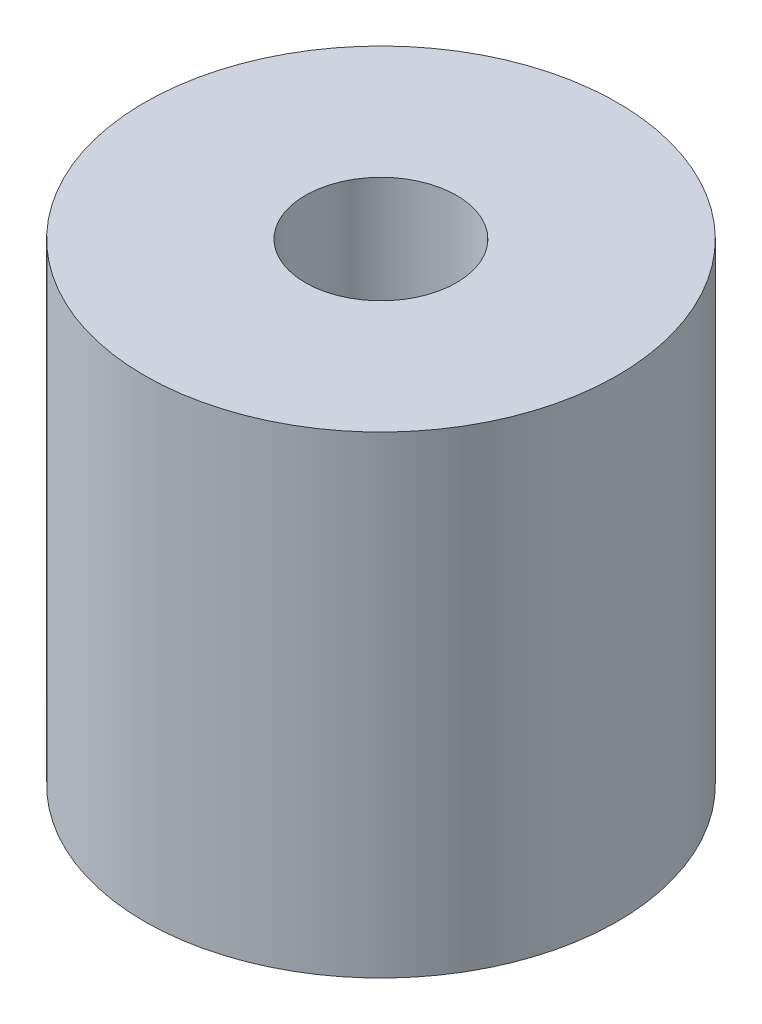
ISO-10303-21;
HEADER;
FILE_DESCRIPTION(('STEP AP214'),'2;1');
FILE_NAME('part.step','',(''),(''),'','','');
FILE_SCHEMA(('AUTOMOTIVE_DESIGN { 1 0 10303 214 1 1 1 1 }'));
ENDSEC;
DATA;
#1=APPLICATION_CONTEXT('core data for automotive mechanical design processes');
#2=APPLICATION_PROTOCOL_DEFINITION('international standard','automotive_design',2000,#1);
#3=PRODUCT_CONTEXT('',#1,'mechanical');
#4=PRODUCT('Part','Part','',(#3));
#5=PRODUCT_RELATED_PRODUCT_CATEGORY('part','',(#4));
#6=PRODUCT_DEFINITION_FORMATION('','',#4);
#7=PRODUCT_DEFINITION_CONTEXT('part definition',#1,'design');
#8=PRODUCT_DEFINITION('design','',#6,#7);
#9=PRODUCT_DEFINITION_SHAPE('','',#8);
#10=(LENGTH_UNIT() NAMED_UNIT(*) SI_UNIT(.MILLI.,.METRE.));
#11=(NAMED_UNIT(*) PLANE_ANGLE_UNIT() SI_UNIT($,.RADIAN.));
#12=(NAMED_UNIT(*) SI_UNIT($,.STERADIAN.) SOLID_ANGLE_UNIT());
#13=UNCERTAINTY_MEASURE_WITH_UNIT(LENGTH_MEASURE(1.E-05),#10,'distance_accuracy_value','');
#14=(GEOMETRIC_REPRESENTATION_CONTEXT(3) GLOBAL_UNCERTAINTY_ASSIGNED_CONTEXT((#13)) GLOBAL_UNIT_ASSIGNED_CONTEXT((#10,
#11,#12)) REPRESENTATION_CONTEXT('',''));
#15=CARTESIAN_POINT('',(0.,0.,0.));
#16=DIRECTION('',(0.,0.,1.));
#17=DIRECTION('',(1.,0.,0.));
#18=AXIS2_PLACEMENT_3D('',#15,#16,#17);
#19=CARTESIAN_POINT('',(0.,25.,0.));
#20=DIRECTION('',(0.,-1.,0.));
#21=DIRECTION('',(0.,0.,-1.));
#22=AXIS2_PLACEMENT_3D('',#19,#20,#21);
#23=CYLINDRICAL_SURFACE('',#22,12.5);
#24=CARTESIAN_POINT('',(0.,25.,0.));
#25=DIRECTION('',(0.,1.,0.));
#26=DIRECTION('',(0.,0.,1.));
#27=AXIS2_PLACEMENT_3D('',#24,#25,#26);
#28=CIRCLE('',#27,12.5);
#29=CARTESIAN_POINT('',(0.,25.,12.5));
#30=VERTEX_POINT('',#29);
#31=EDGE_CURVE('E10',#30,#30,#28,.T.);
#32=ORIENTED_EDGE('',*,*,#31,.F.);
#33=EDGE_LOOP('',(#32));
#34=FACE_BOUND('',#33,.T.);
#35=CARTESIAN_POINT('',(0.,0.,0.));
#36=DIRECTION('',(0.,1.,0.));
#37=DIRECTION('',(0.,0.,1.));
#38=AXIS2_PLACEMENT_3D('',#35,#36,#37);
#39=CIRCLE('',#38,12.5);
#40=CARTESIAN_POINT('',(0.,0.,12.5));
#41=VERTEX_POINT('',#40);
#42=EDGE_CURVE('E39',#41,#41,#39,.T.);
#43=ORIENTED_EDGE('',*,*,#42,.T.);
#44=EDGE_LOOP('',(#43));
#45=FACE_BOUND('',#44,.T.);
#46=ADVANCED_FACE('F32',(#34,#45),#23,.T.);
#47=CARTESIAN_POINT('',(0.,25.,0.));
#48=DIRECTION('',(0.,1.,0.));
#49=DIRECTION('',(0.,0.,1.));
#50=AXIS2_PLACEMENT_3D('',#47,#48,#49);
#51=PLANE('',#50);
#52=CARTESIAN_POINT('',(0.,25.,0.));
#53=DIRECTION('',(0.,1.,0.));
#54=DIRECTION('',(0.,0.,1.));
#55=AXIS2_PLACEMENT_3D('',#52,#53,#54);
#56=CIRCLE('',#55,4.);
#57=CARTESIAN_POINT('',(0.,25.,4.));
#58=VERTEX_POINT('',#57);
#59=EDGE_CURVE('E46',#58,#58,#56,.T.);
#60=ORIENTED_EDGE('',*,*,#59,.F.);
#61=EDGE_LOOP('',(#60));
#62=FACE_BOUND('',#61,.T.);
#63=ORIENTED_EDGE('',*,*,#31,.T.);
#64=EDGE_LOOP('',(#63));
#65=FACE_BOUND('',#64,.T.);
#66=ADVANCED_FACE('F73',(#62,#65),#51,.T.);
#67=CARTESIAN_POINT('',(0.,0.,0.));
#68=DIRECTION('',(0.,1.,0.));
#69=DIRECTION('',(0.,0.,1.));
#70=AXIS2_PLACEMENT_3D('',#67,#68,#69);
#71=PLANE('',#70);
#72=CARTESIAN_POINT('',(0.,0.,0.));
#73=DIRECTION('',(0.,-1.,0.));
#74=DIRECTION('',(0.,0.,-1.));
#75=AXIS2_PLACEMENT_3D('',#72,#73,#74);
#76=CIRCLE('',#75,3.175);
#77=CARTESIAN_POINT('',(0.,0.,-3.175));
#78=VERTEX_POINT('',#77);
#79=EDGE_CURVE('E51',#78,#78,#76,.T.);
#80=ORIENTED_EDGE('',*,*,#79,.F.);
#81=EDGE_LOOP('',(#80));
#82=FACE_BOUND('',#81,.T.);
#83=ORIENTED_EDGE('',*,*,#42,.F.);
#84=EDGE_LOOP('',(#83));
#85=FACE_BOUND('',#84,.T.);
#86=ADVANCED_FACE('F69',(#82,#85),#71,.F.);
#87=CARTESIAN_POINT('',(0.,10.,0.));
#88=DIRECTION('',(0.,1.,0.));
#89=DIRECTION('',(0.,0.,1.));
#90=AXIS2_PLACEMENT_3D('',#87,#88,#89);
#91=CYLINDRICAL_SURFACE('',#90,4.);
#92=CARTESIAN_POINT('',(0.,10.,0.));
#93=DIRECTION('',(0.,1.,0.));
#94=DIRECTION('',(0.,0.,1.));
#95=AXIS2_PLACEMENT_3D('',#92,#93,#94);
#96=CIRCLE('',#95,4.);
#97=CARTESIAN_POINT('',(0.,10.,4.));
#98=VERTEX_POINT('',#97);
#99=EDGE_CURVE('E44',#98,#98,#96,.T.);
#100=ORIENTED_EDGE('',*,*,#99,.F.);
#101=EDGE_LOOP('',(#100));
#102=FACE_BOUND('',#101,.T.);
#103=ORIENTED_EDGE('',*,*,#59,.T.);
#104=EDGE_LOOP('',(#103));
#105=FACE_BOUND('',#104,.T.);
#106=ADVANCED_FACE('F63',(#102,#105),#91,.F.);
#107=CARTESIAN_POINT('',(0.,10.,0.));
#108=DIRECTION('',(0.,1.,0.));
#109=DIRECTION('',(0.,0.,1.));
#110=AXIS2_PLACEMENT_3D('',#107,#108,#109);
#111=PLANE('',#110);
#112=CARTESIAN_POINT('',(0.,10.,0.));
#113=DIRECTION('',(0.,1.,0.));
#114=DIRECTION('',(0.,0.,1.));
#115=AXIS2_PLACEMENT_3D('',#112,#113,#114);
#116=CIRCLE('',#115,3.175);
#117=CARTESIAN_POINT('',(0.,10.,3.175));
#118=VERTEX_POINT('',#117);
#119=EDGE_CURVE('E35',#118,#118,#116,.T.);
#120=ORIENTED_EDGE('',*,*,#119,.F.);
#121=EDGE_LOOP('',(#120));
#122=FACE_BOUND('',#121,.T.);
#123=ORIENTED_EDGE('',*,*,#99,.T.);
#124=EDGE_LOOP('',(#123));
#125=FACE_BOUND('',#124,.T.);
#126=ADVANCED_FACE('F60',(#122,#125),#111,.T.);
#127=CARTESIAN_POINT('',(0.,15.,0.));
#128=DIRECTION('',(0.,-1.,0.));
#129=DIRECTION('',(0.,0.,-1.));
#130=AXIS2_PLACEMENT_3D('',#127,#128,#129);
#131=CYLINDRICAL_SURFACE('',#130,3.175);
#132=ORIENTED_EDGE('',*,*,#119,.T.);
#133=EDGE_LOOP('',(#132));
#134=FACE_BOUND('',#133,.T.);
#135=ORIENTED_EDGE('',*,*,#79,.T.);
#136=EDGE_LOOP('',(#135));
#137=FACE_BOUND('',#136,.T.);
#138=ADVANCED_FACE('F58',(#134,#137),#131,.F.);
#139=CLOSED_SHELL('',(#46,#66,#86,#106,#126,#138));
#140=MANIFOLD_SOLID_BREP('B2',#139);
#141=ADVANCED_BREP_SHAPE_REPRESENTATION('',(#18,#140),#14);
#142=SHAPE_DEFINITION_REPRESENTATION(#9,#141);
ENDSEC;
END-ISO-10303-21;
